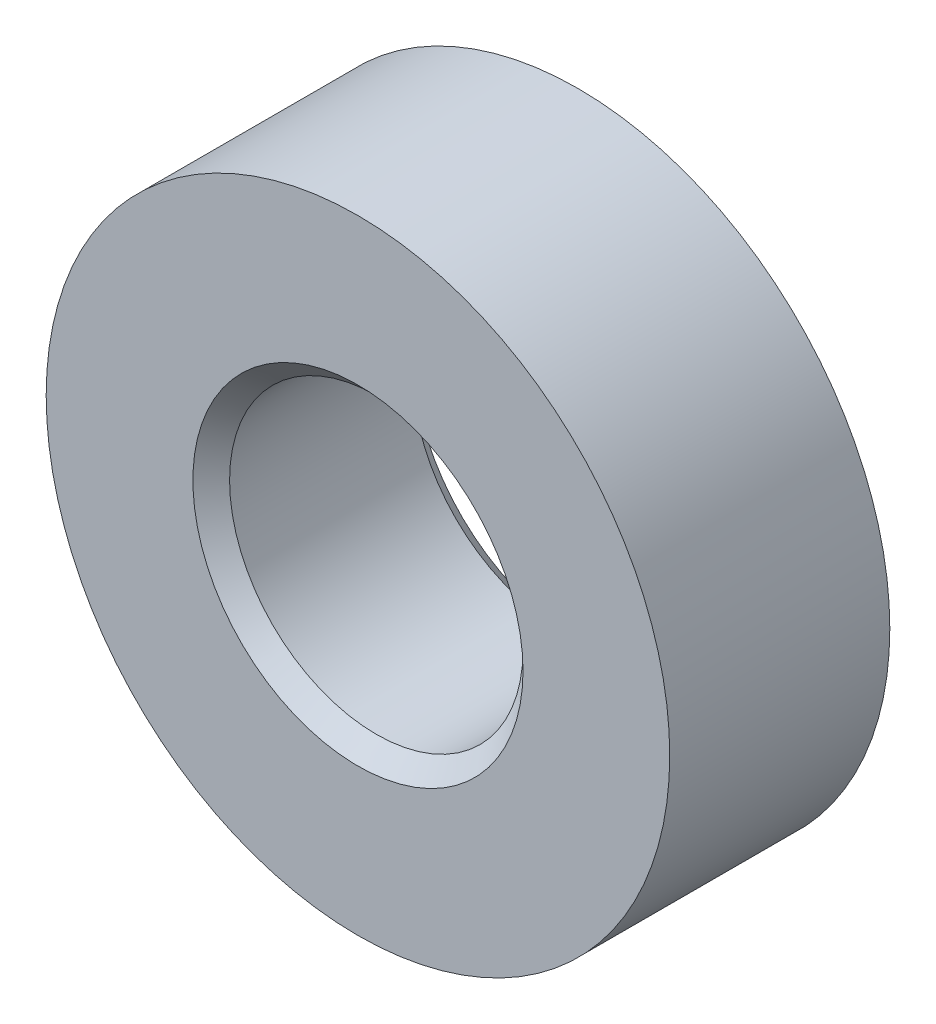
ISO-10303-21;
HEADER;
FILE_DESCRIPTION(('STEP AP214'),'2;1');
FILE_NAME('part.step','',(''),(''),'','','');
FILE_SCHEMA(('AUTOMOTIVE_DESIGN { 1 0 10303 214 1 1 1 1 }'));
ENDSEC;
DATA;
#1=APPLICATION_CONTEXT('core data for automotive mechanical design processes');
#2=APPLICATION_PROTOCOL_DEFINITION('international standard','automotive_design',2000,#1);
#3=PRODUCT_CONTEXT('',#1,'mechanical');
#4=PRODUCT('Part','Part','',(#3));
#5=PRODUCT_RELATED_PRODUCT_CATEGORY('part','',(#4));
#6=PRODUCT_DEFINITION_FORMATION('','',#4);
#7=PRODUCT_DEFINITION_CONTEXT('part definition',#1,'design');
#8=PRODUCT_DEFINITION('design','',#6,#7);
#9=PRODUCT_DEFINITION_SHAPE('','',#8);
#10=(LENGTH_UNIT() NAMED_UNIT(*) SI_UNIT(.MILLI.,.METRE.));
#11=(NAMED_UNIT(*) PLANE_ANGLE_UNIT() SI_UNIT($,.RADIAN.));
#12=(NAMED_UNIT(*) SI_UNIT($,.STERADIAN.) SOLID_ANGLE_UNIT());
#13=UNCERTAINTY_MEASURE_WITH_UNIT(LENGTH_MEASURE(1.E-05),#10,'distance_accuracy_value','');
#14=(GEOMETRIC_REPRESENTATION_CONTEXT(3) GLOBAL_UNCERTAINTY_ASSIGNED_CONTEXT((#13)) GLOBAL_UNIT_ASSIGNED_CONTEXT((#10,
#11,#12)) REPRESENTATION_CONTEXT('',''));
#15=CARTESIAN_POINT('',(0.,0.,0.));
#16=DIRECTION('',(0.,0.,1.));
#17=DIRECTION('',(1.,0.,0.));
#18=AXIS2_PLACEMENT_3D('',#15,#16,#17);
#19=CARTESIAN_POINT('',(0.,0.,6.));
#20=DIRECTION('',(0.,0.,1.));
#21=DIRECTION('',(1.,0.,0.));
#22=AXIS2_PLACEMENT_3D('',#19,#20,#21);
#23=PLANE('',#22);
#24=CARTESIAN_POINT('',(0.,0.,6.));
#25=DIRECTION('',(0.,0.,1.));
#26=DIRECTION('',(1.,0.,0.));
#27=AXIS2_PLACEMENT_3D('',#24,#25,#26);
#28=CIRCLE('',#27,4.5);
#29=CARTESIAN_POINT('',(4.5,0.,6.));
#30=VERTEX_POINT('',#29);
#31=EDGE_CURVE('E10',#30,#30,#28,.F.);
#32=ORIENTED_EDGE('',*,*,#31,.T.);
#33=EDGE_LOOP('',(#32));
#34=FACE_BOUND('',#33,.T.);
#35=CARTESIAN_POINT('',(0.,0.,6.));
#36=DIRECTION('',(0.,0.,1.));
#37=DIRECTION('',(1.,0.,0.));
#38=AXIS2_PLACEMENT_3D('',#35,#36,#37);
#39=CIRCLE('',#38,8.5);
#40=CARTESIAN_POINT('',(8.5,0.,6.));
#41=VERTEX_POINT('',#40);
#42=EDGE_CURVE('E63',#41,#41,#39,.T.);
#43=ORIENTED_EDGE('',*,*,#42,.T.);
#44=EDGE_LOOP('',(#43));
#45=FACE_BOUND('',#44,.T.);
#46=ADVANCED_FACE('F38',(#34,#45),#23,.T.);
#47=CARTESIAN_POINT('',(0.,0.,0.));
#48=DIRECTION('',(0.,0.,1.));
#49=DIRECTION('',(1.,0.,0.));
#50=AXIS2_PLACEMENT_3D('',#47,#48,#49);
#51=PLANE('',#50);
#52=CARTESIAN_POINT('',(0.,0.,0.));
#53=DIRECTION('',(0.,0.,1.));
#54=DIRECTION('',(1.,0.,0.));
#55=AXIS2_PLACEMENT_3D('',#52,#53,#54);
#56=CIRCLE('',#55,4.5);
#57=CARTESIAN_POINT('',(4.5,0.,0.));
#58=VERTEX_POINT('',#57);
#59=EDGE_CURVE('E57',#58,#58,#56,.T.);
#60=ORIENTED_EDGE('',*,*,#59,.T.);
#61=EDGE_LOOP('',(#60));
#62=FACE_BOUND('',#61,.T.);
#63=CARTESIAN_POINT('',(0.,0.,0.));
#64=DIRECTION('',(0.,0.,1.));
#65=DIRECTION('',(1.,0.,0.));
#66=AXIS2_PLACEMENT_3D('',#63,#64,#65);
#67=CIRCLE('',#66,8.5);
#68=CARTESIAN_POINT('',(8.5,0.,0.));
#69=VERTEX_POINT('',#68);
#70=EDGE_CURVE('E64',#69,#69,#67,.T.);
#71=ORIENTED_EDGE('',*,*,#70,.F.);
#72=EDGE_LOOP('',(#71));
#73=FACE_BOUND('',#72,.T.);
#74=ADVANCED_FACE('F77',(#62,#73),#51,.F.);
#75=CARTESIAN_POINT('',(0.,0.,6.));
#76=DIRECTION('',(0.,0.,-1.));
#77=DIRECTION('',(-1.,0.,0.));
#78=AXIS2_PLACEMENT_3D('',#75,#76,#77);
#79=CYLINDRICAL_SURFACE('',#78,8.5);
#80=ORIENTED_EDGE('',*,*,#42,.F.);
#81=EDGE_LOOP('',(#80));
#82=FACE_BOUND('',#81,.T.);
#83=ORIENTED_EDGE('',*,*,#70,.T.);
#84=EDGE_LOOP('',(#83));
#85=FACE_BOUND('',#84,.T.);
#86=ADVANCED_FACE('F73',(#82,#85),#79,.T.);
#87=CARTESIAN_POINT('',(0.,0.,6.));
#88=DIRECTION('',(0.,0.,-1.));
#89=DIRECTION('',(-1.,0.,0.));
#90=AXIS2_PLACEMENT_3D('',#87,#88,#89);
#91=CYLINDRICAL_SURFACE('',#90,4.);
#92=CARTESIAN_POINT('',(0.,0.,0.500000000000002));
#93=DIRECTION('',(0.,0.,1.));
#94=DIRECTION('',(1.,0.,0.));
#95=AXIS2_PLACEMENT_3D('',#92,#93,#94);
#96=CIRCLE('',#95,4.);
#97=CARTESIAN_POINT('',(4.,0.,0.500000000000002));
#98=VERTEX_POINT('',#97);
#99=EDGE_CURVE('E47',#98,#98,#96,.F.);
#100=ORIENTED_EDGE('',*,*,#99,.T.);
#101=EDGE_LOOP('',(#100));
#102=FACE_BOUND('',#101,.T.);
#103=CARTESIAN_POINT('',(0.,0.,5.5));
#104=DIRECTION('',(0.,0.,1.));
#105=DIRECTION('',(1.,0.,0.));
#106=AXIS2_PLACEMENT_3D('',#103,#104,#105);
#107=CIRCLE('',#106,4.);
#108=CARTESIAN_POINT('',(4.,0.,5.5));
#109=VERTEX_POINT('',#108);
#110=EDGE_CURVE('E52',#109,#109,#107,.T.);
#111=ORIENTED_EDGE('',*,*,#110,.T.);
#112=EDGE_LOOP('',(#111));
#113=FACE_BOUND('',#112,.T.);
#114=ADVANCED_FACE('F76',(#102,#113),#91,.F.);
#115=CARTESIAN_POINT('',(0.,0.,0.));
#116=DIRECTION('',(0.,0.,-1.));
#117=DIRECTION('',(-1.,0.,0.));
#118=AXIS2_PLACEMENT_3D('',#115,#116,#117);
#119=CONICAL_SURFACE('',#118,4.5,0.785398163397447);
#120=ORIENTED_EDGE('',*,*,#99,.F.);
#121=EDGE_LOOP('',(#120));
#122=FACE_BOUND('',#121,.T.);
#123=ORIENTED_EDGE('',*,*,#59,.F.);
#124=EDGE_LOOP('',(#123));
#125=FACE_BOUND('',#124,.T.);
#126=ADVANCED_FACE('F91',(#122,#125),#119,.F.);
#127=CARTESIAN_POINT('',(0.,0.,5.5));
#128=DIRECTION('',(0.,0.,1.));
#129=DIRECTION('',(1.,0.,0.));
#130=AXIS2_PLACEMENT_3D('',#127,#128,#129);
#131=CONICAL_SURFACE('',#130,4.,0.785398163397452);
#132=ORIENTED_EDGE('',*,*,#31,.F.);
#133=EDGE_LOOP('',(#132));
#134=FACE_BOUND('',#133,.T.);
#135=ORIENTED_EDGE('',*,*,#110,.F.);
#136=EDGE_LOOP('',(#135));
#137=FACE_BOUND('',#136,.T.);
#138=ADVANCED_FACE('F41',(#134,#137),#131,.F.);
#139=CLOSED_SHELL('',(#46,#74,#86,#114,#126,#138));
#140=MANIFOLD_SOLID_BREP('B2',#139);
#141=ADVANCED_BREP_SHAPE_REPRESENTATION('',(#18,#140),#14);
#142=SHAPE_DEFINITION_REPRESENTATION(#9,#141);
ENDSEC;
END-ISO-10303-21;
